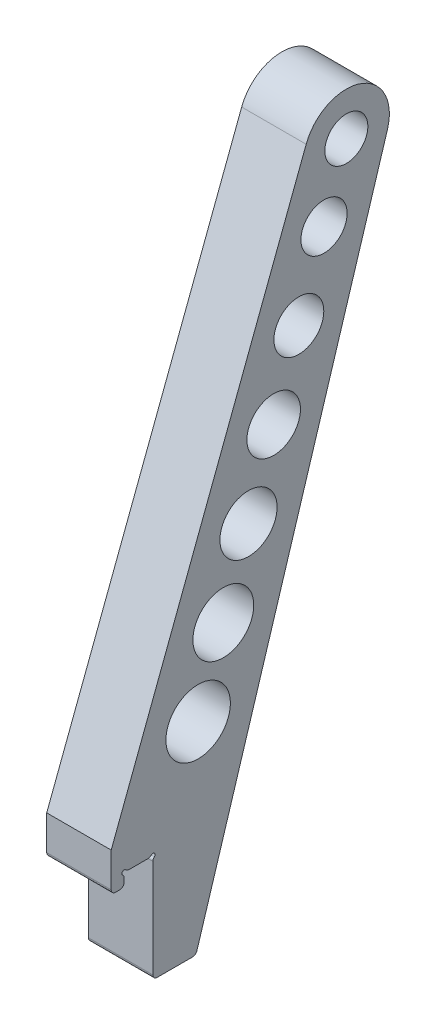
ISO-10303-21;
HEADER;
FILE_DESCRIPTION(('STEP AP214'),'2;1');
FILE_NAME('part.step','',(''),(''),'','','');
FILE_SCHEMA(('AUTOMOTIVE_DESIGN { 1 0 10303 214 1 1 1 1 }'));
ENDSEC;
DATA;
#1=APPLICATION_CONTEXT('core data for automotive mechanical design processes');
#2=APPLICATION_PROTOCOL_DEFINITION('international standard','automotive_design',2000,#1);
#3=PRODUCT_CONTEXT('',#1,'mechanical');
#4=PRODUCT('Part','Part','',(#3));
#5=PRODUCT_RELATED_PRODUCT_CATEGORY('part','',(#4));
#6=PRODUCT_DEFINITION_FORMATION('','',#4);
#7=PRODUCT_DEFINITION_CONTEXT('part definition',#1,'design');
#8=PRODUCT_DEFINITION('design','',#6,#7);
#9=PRODUCT_DEFINITION_SHAPE('','',#8);
#10=(LENGTH_UNIT() NAMED_UNIT(*) SI_UNIT(.MILLI.,.METRE.));
#11=(NAMED_UNIT(*) PLANE_ANGLE_UNIT() SI_UNIT($,.RADIAN.));
#12=(NAMED_UNIT(*) SI_UNIT($,.STERADIAN.) SOLID_ANGLE_UNIT());
#13=UNCERTAINTY_MEASURE_WITH_UNIT(LENGTH_MEASURE(1.E-05),#10,'distance_accuracy_value','');
#14=(GEOMETRIC_REPRESENTATION_CONTEXT(3) GLOBAL_UNCERTAINTY_ASSIGNED_CONTEXT((#13)) GLOBAL_UNIT_ASSIGNED_CONTEXT((#10,
#11,#12)) REPRESENTATION_CONTEXT('',''));
#15=CARTESIAN_POINT('',(0.,0.,0.));
#16=DIRECTION('',(0.,0.,1.));
#17=DIRECTION('',(1.,0.,0.));
#18=AXIS2_PLACEMENT_3D('',#15,#16,#17);
#19=CARTESIAN_POINT('',(15.,0.,6.7));
#20=DIRECTION('',(0.,0.,1.));
#21=DIRECTION('',(1.,0.,0.));
#22=AXIS2_PLACEMENT_3D('',#19,#20,#21);
#23=PLANE('',#22);
#24=DIRECTION('',(0.,1.,0.));
#25=VECTOR('',#24,1.);
#26=CARTESIAN_POINT('',(15.,0.,6.7));
#27=LINE('',#26,#25);
#28=CARTESIAN_POINT('',(15.,-2.,6.7));
#29=VERTEX_POINT('',#28);
#30=CARTESIAN_POINT('',(15.,-1.1180339887499,6.7));
#31=VERTEX_POINT('',#30);
#32=EDGE_CURVE('E478',#29,#31,#27,.T.);
#33=ORIENTED_EDGE('',*,*,#32,.F.);
#34=DIRECTION('',(-1.,0.,0.));
#35=VECTOR('',#34,1.);
#36=CARTESIAN_POINT('',(15.,-2.,6.7));
#37=LINE('',#36,#35);
#38=CARTESIAN_POINT('',(0.,-2.,6.7));
#39=VERTEX_POINT('',#38);
#40=EDGE_CURVE('E328',#29,#39,#37,.T.);
#41=ORIENTED_EDGE('',*,*,#40,.T.);
#42=DIRECTION('',(0.,1.,0.));
#43=VECTOR('',#42,1.);
#44=CARTESIAN_POINT('',(0.,0.,6.7));
#45=LINE('',#44,#43);
#46=CARTESIAN_POINT('',(0.,-1.1180339887499,6.7));
#47=VERTEX_POINT('',#46);
#48=EDGE_CURVE('E251',#39,#47,#45,.T.);
#49=ORIENTED_EDGE('',*,*,#48,.T.);
#50=DIRECTION('',(1.,0.,0.));
#51=VECTOR('',#50,1.);
#52=CARTESIAN_POINT('',(15.,-1.1180339887499,6.7));
#53=LINE('',#52,#51);
#54=EDGE_CURVE('E325',#47,#31,#53,.T.);
#55=ORIENTED_EDGE('',*,*,#54,.T.);
#56=EDGE_LOOP('',(#33,#41,#49,#55));
#57=FACE_BOUND('',#56,.T.);
#58=ADVANCED_FACE('F43',(#57),#23,.F.);
#59=CARTESIAN_POINT('',(15.,0.,0.));
#60=DIRECTION('',(0.,1.,0.));
#61=DIRECTION('',(0.,0.,1.));
#62=AXIS2_PLACEMENT_3D('',#59,#60,#61);
#63=PLANE('',#62);
#64=DIRECTION('',(0.,0.,-1.));
#65=VECTOR('',#64,1.);
#66=CARTESIAN_POINT('',(15.,0.,0.));
#67=LINE('',#66,#65);
#68=CARTESIAN_POINT('',(15.,0.,5.5819660112501));
#69=VERTEX_POINT('',#68);
#70=CARTESIAN_POINT('',(15.,0.,1.11803398874989));
#71=VERTEX_POINT('',#70);
#72=EDGE_CURVE('E482',#69,#71,#67,.T.);
#73=ORIENTED_EDGE('',*,*,#72,.F.);
#74=DIRECTION('',(1.,0.,0.));
#75=VECTOR('',#74,1.);
#76=CARTESIAN_POINT('',(0.,0.,5.5819660112501));
#77=LINE('',#76,#75);
#78=CARTESIAN_POINT('',(0.,0.,5.5819660112501));
#79=VERTEX_POINT('',#78);
#80=EDGE_CURVE('E343',#69,#79,#77,.F.);
#81=ORIENTED_EDGE('',*,*,#80,.T.);
#82=DIRECTION('',(0.,0.,-1.));
#83=VECTOR('',#82,1.);
#84=CARTESIAN_POINT('',(0.,0.,0.));
#85=LINE('',#84,#83);
#86=CARTESIAN_POINT('',(0.,0.,1.11803398874989));
#87=VERTEX_POINT('',#86);
#88=EDGE_CURVE('E255',#79,#87,#85,.T.);
#89=ORIENTED_EDGE('',*,*,#88,.T.);
#90=DIRECTION('',(1.,0.,0.));
#91=VECTOR('',#90,1.);
#92=CARTESIAN_POINT('',(15.,0.,1.11803398874989));
#93=LINE('',#92,#91);
#94=EDGE_CURVE('E340',#87,#71,#93,.T.);
#95=ORIENTED_EDGE('',*,*,#94,.T.);
#96=EDGE_LOOP('',(#73,#81,#89,#95));
#97=FACE_BOUND('',#96,.T.);
#98=ADVANCED_FACE('F496',(#97),#63,.F.);
#99=CARTESIAN_POINT('',(15.,0.,0.));
#100=DIRECTION('',(0.,0.,-1.));
#101=DIRECTION('',(-1.,0.,0.));
#102=AXIS2_PLACEMENT_3D('',#99,#100,#101);
#103=PLANE('',#102);
#104=DIRECTION('',(0.,-1.,0.));
#105=VECTOR('',#104,1.);
#106=CARTESIAN_POINT('',(0.,0.,0.));
#107=LINE('',#106,#105);
#108=CARTESIAN_POINT('',(0.,-1.11803398874989,0.));
#109=VERTEX_POINT('',#108);
#110=CARTESIAN_POINT('',(0.,-24.,0.));
#111=VERTEX_POINT('',#110);
#112=EDGE_CURVE('E259',#109,#111,#107,.T.);
#113=ORIENTED_EDGE('',*,*,#112,.T.);
#114=DIRECTION('',(-1.,0.,0.));
#115=VECTOR('',#114,1.);
#116=CARTESIAN_POINT('',(15.,-24.,0.));
#117=LINE('',#116,#115);
#118=CARTESIAN_POINT('',(15.,-24.,0.));
#119=VERTEX_POINT('',#118);
#120=EDGE_CURVE('E73',#111,#119,#117,.F.);
#121=ORIENTED_EDGE('',*,*,#120,.T.);
#122=DIRECTION('',(0.,-1.,0.));
#123=VECTOR('',#122,1.);
#124=CARTESIAN_POINT('',(15.,0.,0.));
#125=LINE('',#124,#123);
#126=CARTESIAN_POINT('',(15.,-1.11803398874989,0.));
#127=VERTEX_POINT('',#126);
#128=EDGE_CURVE('E378',#127,#119,#125,.T.);
#129=ORIENTED_EDGE('',*,*,#128,.F.);
#130=DIRECTION('',(1.,0.,0.));
#131=VECTOR('',#130,1.);
#132=CARTESIAN_POINT('',(0.,-1.1180339887499,0.));
#133=LINE('',#132,#131);
#134=EDGE_CURVE('E354',#127,#109,#133,.F.);
#135=ORIENTED_EDGE('',*,*,#134,.T.);
#136=EDGE_LOOP('',(#113,#121,#129,#135));
#137=FACE_BOUND('',#136,.T.);
#138=ADVANCED_FACE('F391',(#137),#103,.F.);
#139=CARTESIAN_POINT('',(15.,121.963109176505,-45.));
#140=DIRECTION('',(-1.,0.,0.));
#141=DIRECTION('',(0.,0.,1.));
#142=AXIS2_PLACEMENT_3D('',#139,#140,#141);
#143=PLANE('',#142);
#144=ORIENTED_EDGE('',*,*,#128,.T.);
#145=CARTESIAN_POINT('',(15.,-24.,-1.));
#146=DIRECTION('',(-1.,0.,0.));
#147=DIRECTION('',(0.,0.,1.));
#148=AXIS2_PLACEMENT_3D('',#145,#146,#147);
#149=CIRCLE('',#148,1.);
#150=CARTESIAN_POINT('',(15.,-25.,-1.));
#151=VERTEX_POINT('',#150);
#152=EDGE_CURVE('E52',#119,#151,#149,.F.);
#153=ORIENTED_EDGE('',*,*,#152,.T.);
#154=DIRECTION('',(0.,0.,-1.));
#155=VECTOR('',#154,1.);
#156=CARTESIAN_POINT('',(15.,-25.,0.));
#157=LINE('',#156,#155);
#158=CARTESIAN_POINT('',(15.,-25.,-9.26261643998388));
#159=VERTEX_POINT('',#158);
#160=EDGE_CURVE('E220',#151,#159,#157,.T.);
#161=ORIENTED_EDGE('',*,*,#160,.T.);
#162=CARTESIAN_POINT('',(15.,-24.,-9.26261643998388));
#163=DIRECTION('',(-1.,0.,0.));
#164=DIRECTION('',(0.,0.,1.));
#165=AXIS2_PLACEMENT_3D('',#162,#163,#164);
#166=CIRCLE('',#165,1.);
#167=CARTESIAN_POINT('',(15.,-24.2955595545141,-10.2179407565044));
#168=VERTEX_POINT('',#167);
#169=EDGE_CURVE('E62',#159,#168,#166,.F.);
#170=ORIENTED_EDGE('',*,*,#169,.T.);
#171=DIRECTION('',(0.,0.955324316520527,-0.295559554514125));
#172=VECTOR('',#171,1.);
#173=CARTESIAN_POINT('',(15.,-25.,-10.));
#174=LINE('',#173,#172);
#175=CARTESIAN_POINT('',(15.,119.007513631363,-54.5532431652053));
#176=VERTEX_POINT('',#175);
#177=EDGE_CURVE('E210',#168,#176,#174,.T.);
#178=ORIENTED_EDGE('',*,*,#177,.T.);
#179=CARTESIAN_POINT('',(15.,121.963109176505,-45.));
#180=DIRECTION('',(1.,0.,0.));
#181=DIRECTION('',(0.,0.,1.));
#182=AXIS2_PLACEMENT_3D('',#179,#180,#181);
#183=CIRCLE('',#182,10.);
#184=CARTESIAN_POINT('',(15.,125.510935717011,-35.6505119477868));
#185=VERTEX_POINT('',#184);
#186=EDGE_CURVE('E215',#176,#185,#183,.T.);
#187=ORIENTED_EDGE('',*,*,#186,.T.);
#188=DIRECTION('',(0.,-0.93494880522132,0.354782654050655));
#189=VECTOR('',#188,1.);
#190=CARTESIAN_POINT('',(15.,6.,9.7));
#191=LINE('',#190,#189);
#192=CARTESIAN_POINT('',(15.,6.,9.7));
#193=VERTEX_POINT('',#192);
#194=EDGE_CURVE('E235',#185,#193,#191,.T.);
#195=ORIENTED_EDGE('',*,*,#194,.T.);
#196=DIRECTION('',(0.,-1.,0.));
#197=VECTOR('',#196,1.);
#198=CARTESIAN_POINT('',(15.,-3.,9.7));
#199=LINE('',#198,#197);
#200=CARTESIAN_POINT('',(15.,-2.,9.7));
#201=VERTEX_POINT('',#200);
#202=EDGE_CURVE('E274',#193,#201,#199,.T.);
#203=ORIENTED_EDGE('',*,*,#202,.T.);
#204=CARTESIAN_POINT('',(15.,-2.,8.7));
#205=DIRECTION('',(-1.,0.,0.));
#206=DIRECTION('',(0.,0.,1.));
#207=AXIS2_PLACEMENT_3D('',#204,#205,#206);
#208=CIRCLE('',#207,1.);
#209=CARTESIAN_POINT('',(15.,-3.,8.7));
#210=VERTEX_POINT('',#209);
#211=EDGE_CURVE('E322',#201,#210,#208,.F.);
#212=ORIENTED_EDGE('',*,*,#211,.T.);
#213=DIRECTION('',(0.,0.,-1.));
#214=VECTOR('',#213,1.);
#215=CARTESIAN_POINT('',(15.,-3.,6.7));
#216=LINE('',#215,#214);
#217=CARTESIAN_POINT('',(15.,-3.,7.7));
#218=VERTEX_POINT('',#217);
#219=EDGE_CURVE('E474',#210,#218,#216,.T.);
#220=ORIENTED_EDGE('',*,*,#219,.T.);
#221=CARTESIAN_POINT('',(15.,-2.,7.7));
#222=DIRECTION('',(-1.,0.,0.));
#223=DIRECTION('',(0.,0.,1.));
#224=AXIS2_PLACEMENT_3D('',#221,#222,#223);
#225=CIRCLE('',#224,1.);
#226=EDGE_CURVE('E319',#218,#29,#225,.F.);
#227=ORIENTED_EDGE('',*,*,#226,.T.);
#228=ORIENTED_EDGE('',*,*,#32,.T.);
#229=CARTESIAN_POINT('',(15.,-1.1180339887499,7.7));
#230=DIRECTION('',(-1.,0.,0.));
#231=DIRECTION('',(0.,0.,1.));
#232=AXIS2_PLACEMENT_3D('',#229,#230,#231);
#233=CIRCLE('',#232,1.);
#234=CARTESIAN_POINT('',(15.,-0.372677996249966,7.03333333333333));
#235=VERTEX_POINT('',#234);
#236=EDGE_CURVE('E316',#31,#235,#233,.F.);
#237=ORIENTED_EDGE('',*,*,#236,.T.);
#238=CARTESIAN_POINT('',(15.,0.,6.7));
#239=DIRECTION('',(1.,0.,0.));
#240=DIRECTION('',(0.,0.,-1.));
#241=AXIS2_PLACEMENT_3D('',#238,#239,#240);
#242=CIRCLE('',#241,0.500000000000001);
#243=CARTESIAN_POINT('',(15.,0.333333333333333,6.32732200375003));
#244=VERTEX_POINT('',#243);
#245=EDGE_CURVE('E413',#244,#235,#242,.T.);
#246=ORIENTED_EDGE('',*,*,#245,.F.);
#247=CARTESIAN_POINT('',(15.,0.999999999999999,5.5819660112501));
#248=DIRECTION('',(-1.,0.,0.));
#249=DIRECTION('',(0.,0.,1.));
#250=AXIS2_PLACEMENT_3D('',#247,#248,#249);
#251=CIRCLE('',#250,1.);
#252=EDGE_CURVE('E313',#244,#69,#251,.F.);
#253=ORIENTED_EDGE('',*,*,#252,.T.);
#254=ORIENTED_EDGE('',*,*,#72,.T.);
#255=CARTESIAN_POINT('',(15.,1.,1.1180339887499));
#256=DIRECTION('',(-1.,0.,0.));
#257=DIRECTION('',(0.,0.,1.));
#258=AXIS2_PLACEMENT_3D('',#255,#256,#257);
#259=CIRCLE('',#258,1.);
#260=CARTESIAN_POINT('',(15.,0.333333333333333,0.372677996249965));
#261=VERTEX_POINT('',#260);
#262=EDGE_CURVE('E310',#71,#261,#259,.F.);
#263=ORIENTED_EDGE('',*,*,#262,.T.);
#264=CARTESIAN_POINT('',(15.,0.,0.));
#265=DIRECTION('',(1.,0.,0.));
#266=DIRECTION('',(0.,0.,-1.));
#267=AXIS2_PLACEMENT_3D('',#264,#265,#266);
#268=CIRCLE('',#267,0.5);
#269=CARTESIAN_POINT('',(15.,-0.372677996249965,-0.333333333333333));
#270=VERTEX_POINT('',#269);
#271=EDGE_CURVE('E405',#270,#261,#268,.T.);
#272=ORIENTED_EDGE('',*,*,#271,.F.);
#273=CARTESIAN_POINT('',(15.,-1.1180339887499,-0.999999999999999));
#274=DIRECTION('',(-1.,0.,0.));
#275=DIRECTION('',(0.,0.,1.));
#276=AXIS2_PLACEMENT_3D('',#273,#274,#275);
#277=CIRCLE('',#276,1.);
#278=EDGE_CURVE('E307',#270,#127,#277,.F.);
#279=ORIENTED_EDGE('',*,*,#278,.T.);
#280=EDGE_LOOP('',(#144,#153,#161,#170,#178,#187,#195,#203,#212,#220,#227,#228,#237,#246,#253,
#254,#263,#272,#279));
#281=FACE_BOUND('',#280,.T.);
#282=CARTESIAN_POINT('',(15.,121.963109176505,-45.));
#283=DIRECTION('',(1.,0.,0.));
#284=DIRECTION('',(0.,0.,-1.));
#285=AXIS2_PLACEMENT_3D('',#282,#283,#284);
#286=CIRCLE('',#285,5.00000000000001);
#287=CARTESIAN_POINT('',(15.,121.963109176505,-50.));
#288=VERTEX_POINT('',#287);
#289=EDGE_CURVE('E247',#288,#288,#286,.T.);
#290=ORIENTED_EDGE('',*,*,#289,.F.);
#291=EDGE_LOOP('',(#290));
#292=FACE_BOUND('',#291,.T.);
#293=CARTESIAN_POINT('',(15.,38.7803185724801,-16.3812363230592));
#294=DIRECTION('',(1.,0.,0.));
#295=DIRECTION('',(0.,0.,-1.));
#296=AXIS2_PLACEMENT_3D('',#293,#294,#295);
#297=CIRCLE('',#296,7.07534443979565);
#298=CARTESIAN_POINT('',(15.,38.7803185724801,-23.4565807628549));
#299=VERTEX_POINT('',#298);
#300=EDGE_CURVE('E459',#299,#299,#297,.T.);
#301=ORIENTED_EDGE('',*,*,#300,.F.);
#302=EDGE_LOOP('',(#301));
#303=FACE_BOUND('',#302,.T.);
#304=CARTESIAN_POINT('',(15.,21.7595128373168,-10.5252844682511));
#305=DIRECTION('',(1.,0.,0.));
#306=DIRECTION('',(0.,0.,-1.));
#307=AXIS2_PLACEMENT_3D('',#304,#305,#306);
#308=CIRCLE('',#307,7.5);
#309=CARTESIAN_POINT('',(15.,21.7595128373168,-18.0252844682511));
#310=VERTEX_POINT('',#309);
#311=EDGE_CURVE('E451',#310,#310,#308,.T.);
#312=ORIENTED_EDGE('',*,*,#311,.F.);
#313=EDGE_LOOP('',(#312));
#314=FACE_BOUND('',#313,.T.);
#315=CARTESIAN_POINT('',(15.,55.8011243076434,-22.2371881778674));
#316=DIRECTION('',(1.,0.,0.));
#317=DIRECTION('',(0.,0.,-1.));
#318=AXIS2_PLACEMENT_3D('',#315,#316,#317);
#319=CIRCLE('',#318,6.6506888795913);
#320=CARTESIAN_POINT('',(15.,55.8011243076434,-28.8878770574587));
#321=VERTEX_POINT('',#320);
#322=EDGE_CURVE('E443',#321,#321,#319,.T.);
#323=ORIENTED_EDGE('',*,*,#322,.F.);
#324=EDGE_LOOP('',(#323));
#325=FACE_BOUND('',#324,.T.);
#326=CARTESIAN_POINT('',(15.,72.8219300428067,-28.0931400326756));
#327=DIRECTION('',(1.,0.,0.));
#328=DIRECTION('',(0.,0.,-1.));
#329=AXIS2_PLACEMENT_3D('',#326,#327,#328);
#330=CIRCLE('',#329,6.22603331938695);
#331=CARTESIAN_POINT('',(15.,72.8219300428067,-34.3191733520625));
#332=VERTEX_POINT('',#331);
#333=EDGE_CURVE('E435',#332,#332,#330,.T.);
#334=ORIENTED_EDGE('',*,*,#333,.F.);
#335=EDGE_LOOP('',(#334));
#336=FACE_BOUND('',#335,.T.);
#337=CARTESIAN_POINT('',(15.,89.8427357779701,-33.9490918874837));
#338=DIRECTION('',(1.,0.,0.));
#339=DIRECTION('',(0.,0.,-1.));
#340=AXIS2_PLACEMENT_3D('',#337,#338,#339);
#341=CIRCLE('',#340,5.8013777591826);
#342=CARTESIAN_POINT('',(15.,89.8427357779701,-39.7504696466663));
#343=VERTEX_POINT('',#342);
#344=EDGE_CURVE('E428',#343,#343,#341,.T.);
#345=ORIENTED_EDGE('',*,*,#344,.F.);
#346=EDGE_LOOP('',(#345));
#347=FACE_BOUND('',#346,.T.);
#348=CARTESIAN_POINT('',(15.,106.863541513133,-39.8050437422919));
#349=DIRECTION('',(1.,0.,0.));
#350=DIRECTION('',(0.,0.,-1.));
#351=AXIS2_PLACEMENT_3D('',#348,#349,#350);
#352=CIRCLE('',#351,5.37672219897827);
#353=CARTESIAN_POINT('',(15.,106.863541513133,-45.1817659412702));
#354=VERTEX_POINT('',#353);
#355=EDGE_CURVE('E421',#354,#354,#352,.T.);
#356=ORIENTED_EDGE('',*,*,#355,.F.);
#357=EDGE_LOOP('',(#356));
#358=FACE_BOUND('',#357,.T.);
#359=ADVANCED_FACE('F212',(#281,#292,#303,#314,#325,#336,#347,#358),#143,.F.);
#360=CARTESIAN_POINT('',(0.,121.963109176505,-45.));
#361=DIRECTION('',(-1.,0.,0.));
#362=DIRECTION('',(0.,0.,1.));
#363=AXIS2_PLACEMENT_3D('',#360,#361,#362);
#364=PLANE('',#363);
#365=CARTESIAN_POINT('',(0.,89.8427357779701,-33.9490918874837));
#366=DIRECTION('',(1.,0.,0.));
#367=DIRECTION('',(0.,0.,-1.));
#368=AXIS2_PLACEMENT_3D('',#365,#366,#367);
#369=CIRCLE('',#368,5.8013777591826);
#370=CARTESIAN_POINT('',(0.,89.8427357779701,-39.7504696466663));
#371=VERTEX_POINT('',#370);
#372=EDGE_CURVE('E424',#371,#371,#369,.T.);
#373=ORIENTED_EDGE('',*,*,#372,.T.);
#374=EDGE_LOOP('',(#373));
#375=FACE_BOUND('',#374,.T.);
#376=CARTESIAN_POINT('',(0.,55.8011243076434,-22.2371881778674));
#377=DIRECTION('',(1.,0.,0.));
#378=DIRECTION('',(0.,0.,-1.));
#379=AXIS2_PLACEMENT_3D('',#376,#377,#378);
#380=CIRCLE('',#379,6.6506888795913);
#381=CARTESIAN_POINT('',(0.,55.8011243076434,-28.8878770574587));
#382=VERTEX_POINT('',#381);
#383=EDGE_CURVE('E439',#382,#382,#380,.T.);
#384=ORIENTED_EDGE('',*,*,#383,.T.);
#385=EDGE_LOOP('',(#384));
#386=FACE_BOUND('',#385,.T.);
#387=CARTESIAN_POINT('',(0.,38.7803185724801,-16.3812363230592));
#388=DIRECTION('',(1.,0.,0.));
#389=DIRECTION('',(0.,0.,-1.));
#390=AXIS2_PLACEMENT_3D('',#387,#388,#389);
#391=CIRCLE('',#390,7.07534443979565);
#392=CARTESIAN_POINT('',(0.,38.7803185724801,-23.4565807628549));
#393=VERTEX_POINT('',#392);
#394=EDGE_CURVE('E455',#393,#393,#391,.T.);
#395=ORIENTED_EDGE('',*,*,#394,.T.);
#396=EDGE_LOOP('',(#395));
#397=FACE_BOUND('',#396,.T.);
#398=DIRECTION('',(0.,0.,-1.));
#399=VECTOR('',#398,1.);
#400=CARTESIAN_POINT('',(0.,-25.,0.));
#401=LINE('',#400,#399);
#402=CARTESIAN_POINT('',(0.,-25.,-1.));
#403=VERTEX_POINT('',#402);
#404=CARTESIAN_POINT('',(0.,-25.,-9.26261643998388));
#405=VERTEX_POINT('',#404);
#406=EDGE_CURVE('E262',#403,#405,#401,.T.);
#407=ORIENTED_EDGE('',*,*,#406,.F.);
#408=CARTESIAN_POINT('',(0.,-24.,-1.));
#409=DIRECTION('',(-1.,0.,0.));
#410=DIRECTION('',(0.,0.,1.));
#411=AXIS2_PLACEMENT_3D('',#408,#409,#410);
#412=CIRCLE('',#411,1.);
#413=EDGE_CURVE('E367',#403,#111,#412,.T.);
#414=ORIENTED_EDGE('',*,*,#413,.T.);
#415=ORIENTED_EDGE('',*,*,#112,.F.);
#416=CARTESIAN_POINT('',(0.,-1.1180339887499,-0.999999999999999));
#417=DIRECTION('',(-1.,0.,0.));
#418=DIRECTION('',(0.,0.,1.));
#419=AXIS2_PLACEMENT_3D('',#416,#417,#418);
#420=CIRCLE('',#419,1.);
#421=CARTESIAN_POINT('',(0.,-0.372677996249965,-0.333333333333333));
#422=VERTEX_POINT('',#421);
#423=EDGE_CURVE('E286',#109,#422,#420,.T.);
#424=ORIENTED_EDGE('',*,*,#423,.T.);
#425=CARTESIAN_POINT('',(0.,0.,0.));
#426=DIRECTION('',(1.,0.,0.));
#427=DIRECTION('',(0.,0.,-1.));
#428=AXIS2_PLACEMENT_3D('',#425,#426,#427);
#429=CIRCLE('',#428,0.5);
#430=CARTESIAN_POINT('',(0.,0.333333333333333,0.372677996249965));
#431=VERTEX_POINT('',#430);
#432=EDGE_CURVE('E398',#422,#431,#429,.T.);
#433=ORIENTED_EDGE('',*,*,#432,.T.);
#434=CARTESIAN_POINT('',(0.,1.,1.1180339887499));
#435=DIRECTION('',(-1.,0.,0.));
#436=DIRECTION('',(0.,0.,1.));
#437=AXIS2_PLACEMENT_3D('',#434,#435,#436);
#438=CIRCLE('',#437,1.);
#439=EDGE_CURVE('E289',#431,#87,#438,.T.);
#440=ORIENTED_EDGE('',*,*,#439,.T.);
#441=ORIENTED_EDGE('',*,*,#88,.F.);
#442=CARTESIAN_POINT('',(0.,0.999999999999999,5.5819660112501));
#443=DIRECTION('',(-1.,0.,0.));
#444=DIRECTION('',(0.,0.,1.));
#445=AXIS2_PLACEMENT_3D('',#442,#443,#444);
#446=CIRCLE('',#445,1.);
#447=CARTESIAN_POINT('',(0.,0.333333333333333,6.32732200375003));
#448=VERTEX_POINT('',#447);
#449=EDGE_CURVE('E292',#79,#448,#446,.T.);
#450=ORIENTED_EDGE('',*,*,#449,.T.);
#451=CARTESIAN_POINT('',(0.,0.,6.7));
#452=DIRECTION('',(1.,0.,0.));
#453=DIRECTION('',(0.,0.,-1.));
#454=AXIS2_PLACEMENT_3D('',#451,#452,#453);
#455=CIRCLE('',#454,0.500000000000001);
#456=CARTESIAN_POINT('',(0.,-0.372677996249966,7.03333333333333));
#457=VERTEX_POINT('',#456);
#458=EDGE_CURVE('E406',#448,#457,#455,.T.);
#459=ORIENTED_EDGE('',*,*,#458,.T.);
#460=CARTESIAN_POINT('',(0.,-1.1180339887499,7.7));
#461=DIRECTION('',(-1.,0.,0.));
#462=DIRECTION('',(0.,0.,1.));
#463=AXIS2_PLACEMENT_3D('',#460,#461,#462);
#464=CIRCLE('',#463,1.);
#465=EDGE_CURVE('E295',#457,#47,#464,.T.);
#466=ORIENTED_EDGE('',*,*,#465,.T.);
#467=ORIENTED_EDGE('',*,*,#48,.F.);
#468=CARTESIAN_POINT('',(0.,-2.,7.7));
#469=DIRECTION('',(-1.,0.,0.));
#470=DIRECTION('',(0.,0.,1.));
#471=AXIS2_PLACEMENT_3D('',#468,#469,#470);
#472=CIRCLE('',#471,1.);
#473=CARTESIAN_POINT('',(0.,-3.,7.7));
#474=VERTEX_POINT('',#473);
#475=EDGE_CURVE('E298',#39,#474,#472,.T.);
#476=ORIENTED_EDGE('',*,*,#475,.T.);
#477=DIRECTION('',(0.,0.,-1.));
#478=VECTOR('',#477,1.);
#479=CARTESIAN_POINT('',(0.,-3.,6.7));
#480=LINE('',#479,#478);
#481=CARTESIAN_POINT('',(0.,-3.,8.7));
#482=VERTEX_POINT('',#481);
#483=EDGE_CURVE('E246',#482,#474,#480,.T.);
#484=ORIENTED_EDGE('',*,*,#483,.F.);
#485=CARTESIAN_POINT('',(0.,-2.,8.7));
#486=DIRECTION('',(-1.,0.,0.));
#487=DIRECTION('',(0.,0.,1.));
#488=AXIS2_PLACEMENT_3D('',#485,#486,#487);
#489=CIRCLE('',#488,1.);
#490=CARTESIAN_POINT('',(0.,-2.,9.7));
#491=VERTEX_POINT('',#490);
#492=EDGE_CURVE('E301',#482,#491,#489,.T.);
#493=ORIENTED_EDGE('',*,*,#492,.T.);
#494=DIRECTION('',(0.,-1.,0.));
#495=VECTOR('',#494,1.);
#496=CARTESIAN_POINT('',(0.,-3.,9.7));
#497=LINE('',#496,#495);
#498=CARTESIAN_POINT('',(0.,6.,9.7));
#499=VERTEX_POINT('',#498);
#500=EDGE_CURVE('E242',#499,#491,#497,.T.);
#501=ORIENTED_EDGE('',*,*,#500,.F.);
#502=DIRECTION('',(0.,-0.93494880522132,0.354782654050655));
#503=VECTOR('',#502,1.);
#504=CARTESIAN_POINT('',(0.,6.,9.7));
#505=LINE('',#504,#503);
#506=CARTESIAN_POINT('',(0.,125.510935717011,-35.6505119477868));
#507=VERTEX_POINT('',#506);
#508=EDGE_CURVE('E271',#507,#499,#505,.T.);
#509=ORIENTED_EDGE('',*,*,#508,.F.);
#510=CARTESIAN_POINT('',(0.,121.963109176505,-45.));
#511=DIRECTION('',(1.,0.,0.));
#512=DIRECTION('',(0.,0.,1.));
#513=AXIS2_PLACEMENT_3D('',#510,#511,#512);
#514=CIRCLE('',#513,10.);
#515=CARTESIAN_POINT('',(0.,119.007513631363,-54.5532431652053));
#516=VERTEX_POINT('',#515);
#517=EDGE_CURVE('E268',#516,#507,#514,.T.);
#518=ORIENTED_EDGE('',*,*,#517,.F.);
#519=DIRECTION('',(0.,0.955324316520527,-0.295559554514125));
#520=VECTOR('',#519,1.);
#521=CARTESIAN_POINT('',(0.,-25.,-10.));
#522=LINE('',#521,#520);
#523=CARTESIAN_POINT('',(0.,-24.2955595545141,-10.2179407565044));
#524=VERTEX_POINT('',#523);
#525=EDGE_CURVE('E226',#524,#516,#522,.T.);
#526=ORIENTED_EDGE('',*,*,#525,.F.);
#527=CARTESIAN_POINT('',(0.,-24.,-9.26261643998388));
#528=DIRECTION('',(-1.,0.,0.));
#529=DIRECTION('',(0.,0.,1.));
#530=AXIS2_PLACEMENT_3D('',#527,#528,#529);
#531=CIRCLE('',#530,1.);
#532=EDGE_CURVE('E364',#524,#405,#531,.T.);
#533=ORIENTED_EDGE('',*,*,#532,.T.);
#534=EDGE_LOOP('',(#407,#414,#415,#424,#433,#440,#441,#450,#459,#466,#467,#476,#484,#493,#501,
#509,#518,#526,#533));
#535=FACE_BOUND('',#534,.T.);
#536=CARTESIAN_POINT('',(0.,121.963109176505,-45.));
#537=DIRECTION('',(1.,0.,0.));
#538=DIRECTION('',(0.,0.,-1.));
#539=AXIS2_PLACEMENT_3D('',#536,#537,#538);
#540=CIRCLE('',#539,5.00000000000001);
#541=CARTESIAN_POINT('',(0.,121.963109176505,-50.));
#542=VERTEX_POINT('',#541);
#543=EDGE_CURVE('E462',#542,#542,#540,.T.);
#544=ORIENTED_EDGE('',*,*,#543,.T.);
#545=EDGE_LOOP('',(#544));
#546=FACE_BOUND('',#545,.T.);
#547=CARTESIAN_POINT('',(0.,21.7595128373168,-10.5252844682511));
#548=DIRECTION('',(1.,0.,0.));
#549=DIRECTION('',(0.,0.,-1.));
#550=AXIS2_PLACEMENT_3D('',#547,#548,#549);
#551=CIRCLE('',#550,7.5);
#552=CARTESIAN_POINT('',(0.,21.7595128373168,-18.0252844682511));
#553=VERTEX_POINT('',#552);
#554=EDGE_CURVE('E447',#553,#553,#551,.T.);
#555=ORIENTED_EDGE('',*,*,#554,.T.);
#556=EDGE_LOOP('',(#555));
#557=FACE_BOUND('',#556,.T.);
#558=CARTESIAN_POINT('',(0.,72.8219300428067,-28.0931400326756));
#559=DIRECTION('',(1.,0.,0.));
#560=DIRECTION('',(0.,0.,-1.));
#561=AXIS2_PLACEMENT_3D('',#558,#559,#560);
#562=CIRCLE('',#561,6.22603331938695);
#563=CARTESIAN_POINT('',(0.,72.8219300428067,-34.3191733520625));
#564=VERTEX_POINT('',#563);
#565=EDGE_CURVE('E431',#564,#564,#562,.T.);
#566=ORIENTED_EDGE('',*,*,#565,.T.);
#567=EDGE_LOOP('',(#566));
#568=FACE_BOUND('',#567,.T.);
#569=CARTESIAN_POINT('',(0.,106.863541513133,-39.8050437422919));
#570=DIRECTION('',(1.,0.,0.));
#571=DIRECTION('',(0.,0.,-1.));
#572=AXIS2_PLACEMENT_3D('',#569,#570,#571);
#573=CIRCLE('',#572,5.37672219897827);
#574=CARTESIAN_POINT('',(0.,106.863541513133,-45.1817659412702));
#575=VERTEX_POINT('',#574);
#576=EDGE_CURVE('E409',#575,#575,#573,.T.);
#577=ORIENTED_EDGE('',*,*,#576,.T.);
#578=EDGE_LOOP('',(#577));
#579=FACE_BOUND('',#578,.T.);
#580=ADVANCED_FACE('F388',(#375,#386,#397,#535,#546,#557,#568,#579),#364,.T.);
#581=CARTESIAN_POINT('',(15.,-3.,9.7));
#582=DIRECTION('',(0.,0.,-1.));
#583=DIRECTION('',(-1.,0.,0.));
#584=AXIS2_PLACEMENT_3D('',#581,#582,#583);
#585=PLANE('',#584);
#586=ORIENTED_EDGE('',*,*,#500,.T.);
#587=DIRECTION('',(-1.,0.,0.));
#588=VECTOR('',#587,1.);
#589=CARTESIAN_POINT('',(15.,-2.,9.7));
#590=LINE('',#589,#588);
#591=EDGE_CURVE('E304',#491,#201,#590,.F.);
#592=ORIENTED_EDGE('',*,*,#591,.T.);
#593=ORIENTED_EDGE('',*,*,#202,.F.);
#594=DIRECTION('',(-1.,0.,0.));
#595=VECTOR('',#594,1.);
#596=CARTESIAN_POINT('',(15.,6.,9.7));
#597=LINE('',#596,#595);
#598=EDGE_CURVE('E238',#193,#499,#597,.T.);
#599=ORIENTED_EDGE('',*,*,#598,.T.);
#600=EDGE_LOOP('',(#586,#592,#593,#599));
#601=FACE_BOUND('',#600,.T.);
#602=ADVANCED_FACE('F528',(#601),#585,.F.);
#603=CARTESIAN_POINT('',(15.,-3.,6.7));
#604=DIRECTION('',(0.,1.,0.));
#605=DIRECTION('',(0.,0.,1.));
#606=AXIS2_PLACEMENT_3D('',#603,#604,#605);
#607=PLANE('',#606);
#608=ORIENTED_EDGE('',*,*,#219,.F.);
#609=DIRECTION('',(-1.,0.,0.));
#610=VECTOR('',#609,1.);
#611=CARTESIAN_POINT('',(15.,-3.,8.7));
#612=LINE('',#611,#610);
#613=EDGE_CURVE('E282',#210,#482,#612,.T.);
#614=ORIENTED_EDGE('',*,*,#613,.T.);
#615=ORIENTED_EDGE('',*,*,#483,.T.);
#616=DIRECTION('',(-1.,0.,0.));
#617=VECTOR('',#616,1.);
#618=CARTESIAN_POINT('',(15.,-3.,7.7));
#619=LINE('',#618,#617);
#620=EDGE_CURVE('E229',#474,#218,#619,.F.);
#621=ORIENTED_EDGE('',*,*,#620,.T.);
#622=EDGE_LOOP('',(#608,#614,#615,#621));
#623=FACE_BOUND('',#622,.T.);
#624=ADVANCED_FACE('F519',(#623),#607,.F.);
#625=CARTESIAN_POINT('',(15.,-25.,0.));
#626=DIRECTION('',(0.,1.,0.));
#627=DIRECTION('',(0.,0.,1.));
#628=AXIS2_PLACEMENT_3D('',#625,#626,#627);
#629=PLANE('',#628);
#630=CARTESIAN_POINT('',(7.5,-25.,-5.));
#631=DIRECTION('',(0.,-1.,0.));
#632=DIRECTION('',(0.,0.,-1.));
#633=AXIS2_PLACEMENT_3D('',#630,#631,#632);
#634=CIRCLE('',#633,2.);
#635=CARTESIAN_POINT('',(7.5,-25.,-7.));
#636=VERTEX_POINT('',#635);
#637=EDGE_CURVE('E898',#636,#636,#634,.T.);
#638=ORIENTED_EDGE('',*,*,#637,.F.);
#639=EDGE_LOOP('',(#638));
#640=FACE_BOUND('',#639,.T.);
#641=ORIENTED_EDGE('',*,*,#160,.F.);
#642=DIRECTION('',(-1.,0.,0.));
#643=VECTOR('',#642,1.);
#644=CARTESIAN_POINT('',(15.,-25.,-1.));
#645=LINE('',#644,#643);
#646=EDGE_CURVE('E360',#151,#403,#645,.T.);
#647=ORIENTED_EDGE('',*,*,#646,.T.);
#648=ORIENTED_EDGE('',*,*,#406,.T.);
#649=DIRECTION('',(-1.,0.,0.));
#650=VECTOR('',#649,1.);
#651=CARTESIAN_POINT('',(15.,-25.,-9.26261643998388));
#652=LINE('',#651,#650);
#653=EDGE_CURVE('E357',#405,#159,#652,.F.);
#654=ORIENTED_EDGE('',*,*,#653,.T.);
#655=EDGE_LOOP('',(#641,#647,#648,#654));
#656=FACE_BOUND('',#655,.T.);
#657=ADVANCED_FACE('F382',(#640,#656),#629,.F.);
#658=CARTESIAN_POINT('',(15.,-25.,-10.));
#659=DIRECTION('',(0.,0.295559554514125,0.955324316520527));
#660=DIRECTION('',(0.,-0.955324316520527,0.295559554514125));
#661=AXIS2_PLACEMENT_3D('',#658,#659,#660);
#662=PLANE('',#661);
#663=ORIENTED_EDGE('',*,*,#177,.F.);
#664=DIRECTION('',(-1.,0.,0.));
#665=VECTOR('',#664,1.);
#666=CARTESIAN_POINT('',(15.,-24.2955595545141,-10.2179407565044));
#667=LINE('',#666,#665);
#668=EDGE_CURVE('E11',#168,#524,#667,.T.);
#669=ORIENTED_EDGE('',*,*,#668,.T.);
#670=ORIENTED_EDGE('',*,*,#525,.T.);
#671=DIRECTION('',(-1.,0.,0.));
#672=VECTOR('',#671,1.);
#673=CARTESIAN_POINT('',(15.,119.007513631363,-54.5532431652053));
#674=LINE('',#673,#672);
#675=EDGE_CURVE('E223',#176,#516,#674,.T.);
#676=ORIENTED_EDGE('',*,*,#675,.F.);
#677=EDGE_LOOP('',(#663,#669,#670,#676));
#678=FACE_BOUND('',#677,.T.);
#679=ADVANCED_FACE('F224',(#678),#662,.F.);
#680=CARTESIAN_POINT('',(15.,121.963109176505,-45.));
#681=DIRECTION('',(-1.,0.,0.));
#682=DIRECTION('',(0.,0.,1.));
#683=AXIS2_PLACEMENT_3D('',#680,#681,#682);
#684=CYLINDRICAL_SURFACE('',#683,10.);
#685=ORIENTED_EDGE('',*,*,#517,.T.);
#686=DIRECTION('',(-1.,0.,0.));
#687=VECTOR('',#686,1.);
#688=CARTESIAN_POINT('',(15.,125.510935717011,-35.6505119477868));
#689=LINE('',#688,#687);
#690=EDGE_CURVE('E230',#185,#507,#689,.T.);
#691=ORIENTED_EDGE('',*,*,#690,.F.);
#692=ORIENTED_EDGE('',*,*,#186,.F.);
#693=ORIENTED_EDGE('',*,*,#675,.T.);
#694=EDGE_LOOP('',(#685,#691,#692,#693));
#695=FACE_BOUND('',#694,.T.);
#696=ADVANCED_FACE('F232',(#695),#684,.T.);
#697=CARTESIAN_POINT('',(15.,6.,9.7));
#698=DIRECTION('',(0.,-0.354782654050655,-0.93494880522132));
#699=DIRECTION('',(0.,0.93494880522132,-0.354782654050655));
#700=AXIS2_PLACEMENT_3D('',#697,#698,#699);
#701=PLANE('',#700);
#702=ORIENTED_EDGE('',*,*,#508,.T.);
#703=ORIENTED_EDGE('',*,*,#598,.F.);
#704=ORIENTED_EDGE('',*,*,#194,.F.);
#705=ORIENTED_EDGE('',*,*,#690,.T.);
#706=EDGE_LOOP('',(#702,#703,#704,#705));
#707=FACE_BOUND('',#706,.T.);
#708=ADVANCED_FACE('F532',(#707),#701,.F.);
#709=CARTESIAN_POINT('',(15.,121.963109176505,-45.));
#710=DIRECTION('',(-1.,0.,0.));
#711=DIRECTION('',(0.,0.,1.));
#712=AXIS2_PLACEMENT_3D('',#709,#710,#711);
#713=CYLINDRICAL_SURFACE('',#712,5.00000000000001);
#714=ORIENTED_EDGE('',*,*,#289,.T.);
#715=EDGE_LOOP('',(#714));
#716=FACE_BOUND('',#715,.T.);
#717=ORIENTED_EDGE('',*,*,#543,.F.);
#718=EDGE_LOOP('',(#717));
#719=FACE_BOUND('',#718,.T.);
#720=ADVANCED_FACE('F753',(#716,#719),#713,.F.);
#721=CARTESIAN_POINT('',(15.,38.7803185724801,-16.3812363230592));
#722=DIRECTION('',(-1.,0.,0.));
#723=DIRECTION('',(0.,0.,1.));
#724=AXIS2_PLACEMENT_3D('',#721,#722,#723);
#725=CYLINDRICAL_SURFACE('',#724,7.07534443979565);
#726=ORIENTED_EDGE('',*,*,#300,.T.);
#727=EDGE_LOOP('',(#726));
#728=FACE_BOUND('',#727,.T.);
#729=ORIENTED_EDGE('',*,*,#394,.F.);
#730=EDGE_LOOP('',(#729));
#731=FACE_BOUND('',#730,.T.);
#732=ADVANCED_FACE('F743',(#728,#731),#725,.F.);
#733=CARTESIAN_POINT('',(15.,21.7595128373168,-10.5252844682511));
#734=DIRECTION('',(-1.,0.,0.));
#735=DIRECTION('',(0.,0.,1.));
#736=AXIS2_PLACEMENT_3D('',#733,#734,#735);
#737=CYLINDRICAL_SURFACE('',#736,7.5);
#738=ORIENTED_EDGE('',*,*,#311,.T.);
#739=EDGE_LOOP('',(#738));
#740=FACE_BOUND('',#739,.T.);
#741=ORIENTED_EDGE('',*,*,#554,.F.);
#742=EDGE_LOOP('',(#741));
#743=FACE_BOUND('',#742,.T.);
#744=ADVANCED_FACE('F733',(#740,#743),#737,.F.);
#745=CARTESIAN_POINT('',(15.,55.8011243076434,-22.2371881778674));
#746=DIRECTION('',(-1.,0.,0.));
#747=DIRECTION('',(0.,0.,1.));
#748=AXIS2_PLACEMENT_3D('',#745,#746,#747);
#749=CYLINDRICAL_SURFACE('',#748,6.6506888795913);
#750=ORIENTED_EDGE('',*,*,#322,.T.);
#751=EDGE_LOOP('',(#750));
#752=FACE_BOUND('',#751,.T.);
#753=ORIENTED_EDGE('',*,*,#383,.F.);
#754=EDGE_LOOP('',(#753));
#755=FACE_BOUND('',#754,.T.);
#756=ADVANCED_FACE('F723',(#752,#755),#749,.F.);
#757=CARTESIAN_POINT('',(15.,72.8219300428067,-28.0931400326756));
#758=DIRECTION('',(-1.,0.,0.));
#759=DIRECTION('',(0.,0.,1.));
#760=AXIS2_PLACEMENT_3D('',#757,#758,#759);
#761=CYLINDRICAL_SURFACE('',#760,6.22603331938695);
#762=ORIENTED_EDGE('',*,*,#333,.T.);
#763=EDGE_LOOP('',(#762));
#764=FACE_BOUND('',#763,.T.);
#765=ORIENTED_EDGE('',*,*,#565,.F.);
#766=EDGE_LOOP('',(#765));
#767=FACE_BOUND('',#766,.T.);
#768=ADVANCED_FACE('F713',(#764,#767),#761,.F.);
#769=CARTESIAN_POINT('',(15.,89.8427357779701,-33.9490918874837));
#770=DIRECTION('',(-1.,0.,0.));
#771=DIRECTION('',(0.,0.,1.));
#772=AXIS2_PLACEMENT_3D('',#769,#770,#771);
#773=CYLINDRICAL_SURFACE('',#772,5.8013777591826);
#774=ORIENTED_EDGE('',*,*,#344,.T.);
#775=EDGE_LOOP('',(#774));
#776=FACE_BOUND('',#775,.T.);
#777=ORIENTED_EDGE('',*,*,#372,.F.);
#778=EDGE_LOOP('',(#777));
#779=FACE_BOUND('',#778,.T.);
#780=ADVANCED_FACE('F704',(#776,#779),#773,.F.);
#781=CARTESIAN_POINT('',(15.,106.863541513133,-39.8050437422919));
#782=DIRECTION('',(-1.,0.,0.));
#783=DIRECTION('',(0.,0.,1.));
#784=AXIS2_PLACEMENT_3D('',#781,#782,#783);
#785=CYLINDRICAL_SURFACE('',#784,5.37672219897827);
#786=ORIENTED_EDGE('',*,*,#355,.T.);
#787=EDGE_LOOP('',(#786));
#788=FACE_BOUND('',#787,.T.);
#789=ORIENTED_EDGE('',*,*,#576,.F.);
#790=EDGE_LOOP('',(#789));
#791=FACE_BOUND('',#790,.T.);
#792=ADVANCED_FACE('F674',(#788,#791),#785,.F.);
#793=CARTESIAN_POINT('',(15.,0.,0.));
#794=DIRECTION('',(-1.,0.,0.));
#795=DIRECTION('',(0.,0.,1.));
#796=AXIS2_PLACEMENT_3D('',#793,#794,#795);
#797=CYLINDRICAL_SURFACE('',#796,0.5);
#798=ORIENTED_EDGE('',*,*,#271,.T.);
#799=DIRECTION('',(-1.,0.,0.));
#800=VECTOR('',#799,1.);
#801=CARTESIAN_POINT('',(15.,0.333333333333333,0.372677996249965));
#802=LINE('',#801,#800);
#803=EDGE_CURVE('E350',#261,#431,#802,.T.);
#804=ORIENTED_EDGE('',*,*,#803,.T.);
#805=ORIENTED_EDGE('',*,*,#432,.F.);
#806=DIRECTION('',(-1.,0.,0.));
#807=VECTOR('',#806,1.);
#808=CARTESIAN_POINT('',(15.,-0.372677996249965,-0.333333333333333));
#809=LINE('',#808,#807);
#810=EDGE_CURVE('E346',#422,#270,#809,.F.);
#811=ORIENTED_EDGE('',*,*,#810,.T.);
#812=EDGE_LOOP('',(#798,#804,#805,#811));
#813=FACE_BOUND('',#812,.T.);
#814=ADVANCED_FACE('F401',(#813),#797,.F.);
#815=CARTESIAN_POINT('',(15.,0.,6.7));
#816=DIRECTION('',(-1.,0.,0.));
#817=DIRECTION('',(0.,0.,1.));
#818=AXIS2_PLACEMENT_3D('',#815,#816,#817);
#819=CYLINDRICAL_SURFACE('',#818,0.500000000000001);
#820=ORIENTED_EDGE('',*,*,#245,.T.);
#821=DIRECTION('',(-1.,0.,0.));
#822=VECTOR('',#821,1.);
#823=CARTESIAN_POINT('',(15.,-0.372677996249966,7.03333333333333));
#824=LINE('',#823,#822);
#825=EDGE_CURVE('E336',#235,#457,#824,.T.);
#826=ORIENTED_EDGE('',*,*,#825,.T.);
#827=ORIENTED_EDGE('',*,*,#458,.F.);
#828=DIRECTION('',(-1.,0.,0.));
#829=VECTOR('',#828,1.);
#830=CARTESIAN_POINT('',(15.,0.333333333333333,6.32732200375003));
#831=LINE('',#830,#829);
#832=EDGE_CURVE('E332',#448,#244,#831,.F.);
#833=ORIENTED_EDGE('',*,*,#832,.T.);
#834=EDGE_LOOP('',(#820,#826,#827,#833));
#835=FACE_BOUND('',#834,.T.);
#836=ADVANCED_FACE('F502',(#835),#819,.F.);
#837=CARTESIAN_POINT('',(15.,-2.,8.7));
#838=DIRECTION('',(-1.,0.,0.));
#839=DIRECTION('',(0.,0.,1.));
#840=AXIS2_PLACEMENT_3D('',#837,#838,#839);
#841=CYLINDRICAL_SURFACE('',#840,1.);
#842=ORIENTED_EDGE('',*,*,#211,.F.);
#843=ORIENTED_EDGE('',*,*,#591,.F.);
#844=ORIENTED_EDGE('',*,*,#492,.F.);
#845=ORIENTED_EDGE('',*,*,#613,.F.);
#846=EDGE_LOOP('',(#842,#843,#844,#845));
#847=FACE_BOUND('',#846,.T.);
#848=ADVANCED_FACE('F523',(#847),#841,.T.);
#849=CARTESIAN_POINT('',(15.,-2.,7.7));
#850=DIRECTION('',(-1.,0.,0.));
#851=DIRECTION('',(0.,0.,1.));
#852=AXIS2_PLACEMENT_3D('',#849,#850,#851);
#853=CYLINDRICAL_SURFACE('',#852,1.);
#854=ORIENTED_EDGE('',*,*,#226,.F.);
#855=ORIENTED_EDGE('',*,*,#620,.F.);
#856=ORIENTED_EDGE('',*,*,#475,.F.);
#857=ORIENTED_EDGE('',*,*,#40,.F.);
#858=EDGE_LOOP('',(#854,#855,#856,#857));
#859=FACE_BOUND('',#858,.T.);
#860=ADVANCED_FACE('F514',(#859),#853,.T.);
#861=CARTESIAN_POINT('',(15.,-1.1180339887499,7.7));
#862=DIRECTION('',(-1.,0.,0.));
#863=DIRECTION('',(0.,0.,1.));
#864=AXIS2_PLACEMENT_3D('',#861,#862,#863);
#865=CYLINDRICAL_SURFACE('',#864,1.);
#866=ORIENTED_EDGE('',*,*,#236,.F.);
#867=ORIENTED_EDGE('',*,*,#54,.F.);
#868=ORIENTED_EDGE('',*,*,#465,.F.);
#869=ORIENTED_EDGE('',*,*,#825,.F.);
#870=EDGE_LOOP('',(#866,#867,#868,#869));
#871=FACE_BOUND('',#870,.T.);
#872=ADVANCED_FACE('F506',(#871),#865,.T.);
#873=CARTESIAN_POINT('',(15.,0.999999999999999,5.5819660112501));
#874=DIRECTION('',(-1.,0.,0.));
#875=DIRECTION('',(0.,0.,1.));
#876=AXIS2_PLACEMENT_3D('',#873,#874,#875);
#877=CYLINDRICAL_SURFACE('',#876,1.);
#878=ORIENTED_EDGE('',*,*,#449,.F.);
#879=ORIENTED_EDGE('',*,*,#80,.F.);
#880=ORIENTED_EDGE('',*,*,#252,.F.);
#881=ORIENTED_EDGE('',*,*,#832,.F.);
#882=EDGE_LOOP('',(#878,#879,#880,#881));
#883=FACE_BOUND('',#882,.T.);
#884=ADVANCED_FACE('F498',(#883),#877,.T.);
#885=CARTESIAN_POINT('',(15.,1.,1.1180339887499));
#886=DIRECTION('',(-1.,0.,0.));
#887=DIRECTION('',(0.,0.,1.));
#888=AXIS2_PLACEMENT_3D('',#885,#886,#887);
#889=CYLINDRICAL_SURFACE('',#888,1.);
#890=ORIENTED_EDGE('',*,*,#262,.F.);
#891=ORIENTED_EDGE('',*,*,#94,.F.);
#892=ORIENTED_EDGE('',*,*,#439,.F.);
#893=ORIENTED_EDGE('',*,*,#803,.F.);
#894=EDGE_LOOP('',(#890,#891,#892,#893));
#895=FACE_BOUND('',#894,.T.);
#896=ADVANCED_FACE('F493',(#895),#889,.T.);
#897=CARTESIAN_POINT('',(15.,-1.1180339887499,-0.999999999999999));
#898=DIRECTION('',(-1.,0.,0.));
#899=DIRECTION('',(0.,0.,1.));
#900=AXIS2_PLACEMENT_3D('',#897,#898,#899);
#901=CYLINDRICAL_SURFACE('',#900,1.);
#902=ORIENTED_EDGE('',*,*,#423,.F.);
#903=ORIENTED_EDGE('',*,*,#134,.F.);
#904=ORIENTED_EDGE('',*,*,#278,.F.);
#905=ORIENTED_EDGE('',*,*,#810,.F.);
#906=EDGE_LOOP('',(#902,#903,#904,#905));
#907=FACE_BOUND('',#906,.T.);
#908=ADVANCED_FACE('F394',(#907),#901,.T.);
#909=CARTESIAN_POINT('',(15.,-24.,-1.));
#910=DIRECTION('',(-1.,0.,0.));
#911=DIRECTION('',(0.,0.,1.));
#912=AXIS2_PLACEMENT_3D('',#909,#910,#911);
#913=CYLINDRICAL_SURFACE('',#912,1.);
#914=ORIENTED_EDGE('',*,*,#152,.F.);
#915=ORIENTED_EDGE('',*,*,#120,.F.);
#916=ORIENTED_EDGE('',*,*,#413,.F.);
#917=ORIENTED_EDGE('',*,*,#646,.F.);
#918=EDGE_LOOP('',(#914,#915,#916,#917));
#919=FACE_BOUND('',#918,.T.);
#920=ADVANCED_FACE('F385',(#919),#913,.T.);
#921=CARTESIAN_POINT('',(15.,-24.,-9.26261643998388));
#922=DIRECTION('',(-1.,0.,0.));
#923=DIRECTION('',(0.,0.,1.));
#924=AXIS2_PLACEMENT_3D('',#921,#922,#923);
#925=CYLINDRICAL_SURFACE('',#924,1.);
#926=ORIENTED_EDGE('',*,*,#169,.F.);
#927=ORIENTED_EDGE('',*,*,#653,.F.);
#928=ORIENTED_EDGE('',*,*,#532,.F.);
#929=ORIENTED_EDGE('',*,*,#668,.F.);
#930=EDGE_LOOP('',(#926,#927,#928,#929));
#931=FACE_BOUND('',#930,.T.);
#932=ADVANCED_FACE('F45',(#931),#925,.T.);
#933=CARTESIAN_POINT('',(7.5,-16.,-5.));
#934=DIRECTION('',(0.,-1.,0.));
#935=DIRECTION('',(0.,0.,-1.));
#936=AXIS2_PLACEMENT_3D('',#933,#934,#935);
#937=CYLINDRICAL_SURFACE('',#936,2.);
#938=CARTESIAN_POINT('',(7.5,-16.,-5.));
#939=DIRECTION('',(0.,-1.,0.));
#940=DIRECTION('',(0.,0.,-1.));
#941=AXIS2_PLACEMENT_3D('',#938,#939,#940);
#942=CIRCLE('',#941,2.);
#943=CARTESIAN_POINT('',(7.5,-16.,-7.));
#944=VERTEX_POINT('',#943);
#945=EDGE_CURVE('E420',#944,#944,#942,.T.);
#946=ORIENTED_EDGE('',*,*,#945,.F.);
#947=EDGE_LOOP('',(#946));
#948=FACE_BOUND('',#947,.T.);
#949=ORIENTED_EDGE('',*,*,#637,.T.);
#950=EDGE_LOOP('',(#949));
#951=FACE_BOUND('',#950,.T.);
#952=ADVANCED_FACE('F535',(#948,#951),#937,.F.);
#953=CARTESIAN_POINT('',(7.5,-16.,-5.));
#954=DIRECTION('',(0.,-1.,0.));
#955=DIRECTION('',(0.,0.,-1.));
#956=AXIS2_PLACEMENT_3D('',#953,#954,#955);
#957=PLANE('',#956);
#958=ORIENTED_EDGE('',*,*,#945,.T.);
#959=EDGE_LOOP('',(#958));
#960=FACE_BOUND('',#959,.T.);
#961=ADVANCED_FACE('F540',(#960),#957,.T.);
#962=CLOSED_SHELL('',(#58,#98,#138,#359,#580,#602,#624,#657,#679,#696,#708,#720,#732,#744,#756,
#768,#780,#792,#814,#836,#848,#860,#872,#884,#896,#908,#920,#932,#952,#961));
#963=MANIFOLD_SOLID_BREP('B2',#962);
#964=ADVANCED_BREP_SHAPE_REPRESENTATION('',(#18,#963),#14);
#965=SHAPE_DEFINITION_REPRESENTATION(#9,#964);
ENDSEC;
END-ISO-10303-21;
